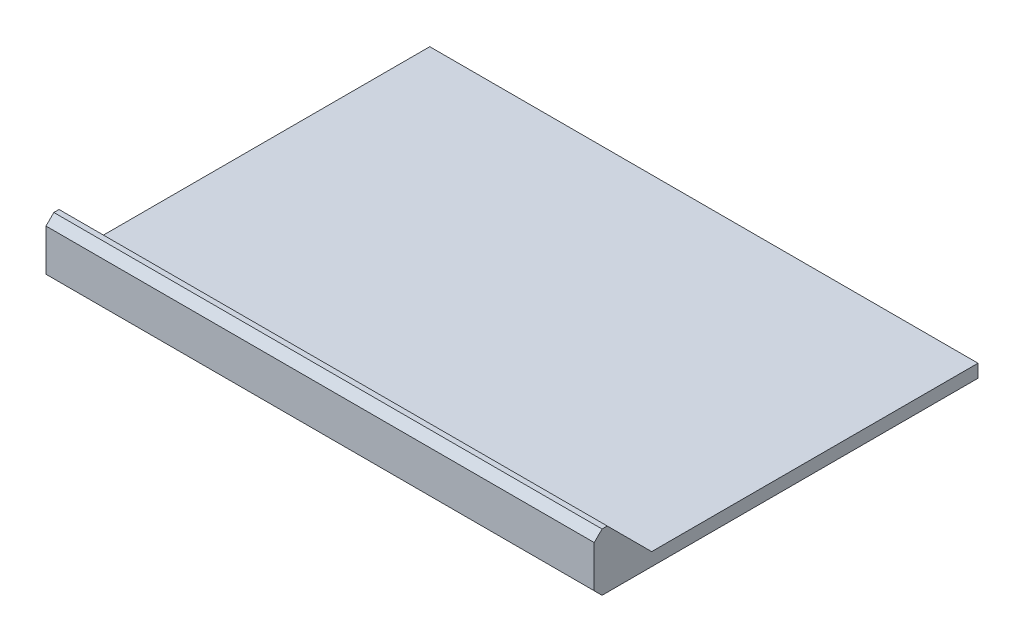
ISO-10303-21;
HEADER;
FILE_DESCRIPTION(('STEP AP214'),'2;1');
FILE_NAME('part.step','',(''),(''),'','','');
FILE_SCHEMA(('AUTOMOTIVE_DESIGN { 1 0 10303 214 1 1 1 1 }'));
ENDSEC;
DATA;
#1=APPLICATION_CONTEXT('core data for automotive mechanical design processes');
#2=APPLICATION_PROTOCOL_DEFINITION('international standard','automotive_design',2000,#1);
#3=PRODUCT_CONTEXT('',#1,'mechanical');
#4=PRODUCT('Part','Part','',(#3));
#5=PRODUCT_RELATED_PRODUCT_CATEGORY('part','',(#4));
#6=PRODUCT_DEFINITION_FORMATION('','',#4);
#7=PRODUCT_DEFINITION_CONTEXT('part definition',#1,'design');
#8=PRODUCT_DEFINITION('design','',#6,#7);
#9=PRODUCT_DEFINITION_SHAPE('','',#8);
#10=(LENGTH_UNIT() NAMED_UNIT(*) SI_UNIT(.MILLI.,.METRE.));
#11=(NAMED_UNIT(*) PLANE_ANGLE_UNIT() SI_UNIT($,.RADIAN.));
#12=(NAMED_UNIT(*) SI_UNIT($,.STERADIAN.) SOLID_ANGLE_UNIT());
#13=UNCERTAINTY_MEASURE_WITH_UNIT(LENGTH_MEASURE(1.E-05),#10,'distance_accuracy_value','');
#14=(GEOMETRIC_REPRESENTATION_CONTEXT(3) GLOBAL_UNCERTAINTY_ASSIGNED_CONTEXT((#13)) GLOBAL_UNIT_ASSIGNED_CONTEXT((#10,
#11,#12)) REPRESENTATION_CONTEXT('',''));
#15=CARTESIAN_POINT('',(0.,0.,0.));
#16=DIRECTION('',(0.,0.,1.));
#17=DIRECTION('',(1.,0.,0.));
#18=AXIS2_PLACEMENT_3D('',#15,#16,#17);
#19=CARTESIAN_POINT('',(0.,0.,0.));
#20=DIRECTION('',(0.,0.,-1.));
#21=DIRECTION('',(-1.,0.,0.));
#22=AXIS2_PLACEMENT_3D('',#19,#20,#21);
#23=PLANE('',#22);
#24=DIRECTION('',(1.,0.,0.));
#25=VECTOR('',#24,1.);
#26=CARTESIAN_POINT('',(0.,12.7,0.));
#27=LINE('',#26,#25);
#28=CARTESIAN_POINT('',(12.7,12.7,0.));
#29=VERTEX_POINT('',#28);
#30=CARTESIAN_POINT('',(520.7,12.7,-1.59747019993952E-13));
#31=VERTEX_POINT('',#30);
#32=EDGE_CURVE('E182',#29,#31,#27,.T.);
#33=ORIENTED_EDGE('',*,*,#32,.F.);
#34=DIRECTION('',(0.,-1.,0.));
#35=VECTOR('',#34,1.);
#36=CARTESIAN_POINT('',(12.7,55.88,0.));
#37=LINE('',#36,#35);
#38=CARTESIAN_POINT('',(12.7,55.88,0.));
#39=VERTEX_POINT('',#38);
#40=EDGE_CURVE('E128',#39,#29,#37,.T.);
#41=ORIENTED_EDGE('',*,*,#40,.F.);
#42=DIRECTION('',(-1.,0.,0.));
#43=VECTOR('',#42,1.);
#44=CARTESIAN_POINT('',(0.,55.88,0.));
#45=LINE('',#44,#43);
#46=CARTESIAN_POINT('',(520.7,55.88,0.));
#47=VERTEX_POINT('',#46);
#48=EDGE_CURVE('E157',#47,#39,#45,.T.);
#49=ORIENTED_EDGE('',*,*,#48,.F.);
#50=DIRECTION('',(0.,-1.,0.));
#51=VECTOR('',#50,1.);
#52=CARTESIAN_POINT('',(520.7,55.88,-1.59747019993952E-13));
#53=LINE('',#52,#51);
#54=EDGE_CURVE('E148',#47,#31,#53,.T.);
#55=ORIENTED_EDGE('',*,*,#54,.T.);
#56=EDGE_LOOP('',(#33,#41,#49,#55));
#57=FACE_BOUND('',#56,.T.);
#58=ADVANCED_FACE('F35',(#57),#23,.T.);
#59=CARTESIAN_POINT('',(0.,12.7,0.));
#60=DIRECTION('',(0.,-1.,0.));
#61=DIRECTION('',(0.,0.,-1.));
#62=AXIS2_PLACEMENT_3D('',#59,#60,#61);
#63=PLANE('',#62);
#64=DIRECTION('',(-1.,0.,0.));
#65=VECTOR('',#64,1.);
#66=CARTESIAN_POINT('',(12.7,12.7,-43.18));
#67=LINE('',#66,#65);
#68=CARTESIAN_POINT('',(12.7,12.7,-43.18));
#69=VERTEX_POINT('',#68);
#70=CARTESIAN_POINT('',(0.,12.7,-43.18));
#71=VERTEX_POINT('',#70);
#72=EDGE_CURVE('E122',#69,#71,#67,.T.);
#73=ORIENTED_EDGE('',*,*,#72,.F.);
#74=DIRECTION('',(0.,0.,-1.));
#75=VECTOR('',#74,1.);
#76=CARTESIAN_POINT('',(12.7,12.7,0.));
#77=LINE('',#76,#75);
#78=EDGE_CURVE('E129',#29,#69,#77,.T.);
#79=ORIENTED_EDGE('',*,*,#78,.F.);
#80=ORIENTED_EDGE('',*,*,#32,.T.);
#81=DIRECTION('',(0.,0.,-1.));
#82=VECTOR('',#81,1.);
#83=CARTESIAN_POINT('',(520.7,12.7,-1.59747019993952E-13));
#84=LINE('',#83,#82);
#85=CARTESIAN_POINT('',(520.7,12.7,-43.1800000000002));
#86=VERTEX_POINT('',#85);
#87=EDGE_CURVE('E151',#31,#86,#84,.T.);
#88=ORIENTED_EDGE('',*,*,#87,.T.);
#89=DIRECTION('',(1.,0.,0.));
#90=VECTOR('',#89,1.);
#91=CARTESIAN_POINT('',(520.7,12.7,-43.1800000000002));
#92=LINE('',#91,#90);
#93=CARTESIAN_POINT('',(533.4,12.7,-43.1800000000002));
#94=VERTEX_POINT('',#93);
#95=EDGE_CURVE('E153',#86,#94,#92,.T.);
#96=ORIENTED_EDGE('',*,*,#95,.T.);
#97=DIRECTION('',(0.,0.,1.));
#98=VECTOR('',#97,1.);
#99=CARTESIAN_POINT('',(533.4,12.7,-360.68));
#100=LINE('',#99,#98);
#101=CARTESIAN_POINT('',(533.4,12.7,-360.68));
#102=VERTEX_POINT('',#101);
#103=EDGE_CURVE('E179',#102,#94,#100,.T.);
#104=ORIENTED_EDGE('',*,*,#103,.F.);
#105=DIRECTION('',(1.,0.,0.));
#106=VECTOR('',#105,1.);
#107=CARTESIAN_POINT('',(0.,12.7,-360.68));
#108=LINE('',#107,#106);
#109=CARTESIAN_POINT('',(0.,12.7,-360.68));
#110=VERTEX_POINT('',#109);
#111=EDGE_CURVE('E175',#110,#102,#108,.T.);
#112=ORIENTED_EDGE('',*,*,#111,.F.);
#113=DIRECTION('',(0.,0.,-1.));
#114=VECTOR('',#113,1.);
#115=CARTESIAN_POINT('',(0.,12.7,0.));
#116=LINE('',#115,#114);
#117=EDGE_CURVE('E139',#71,#110,#116,.T.);
#118=ORIENTED_EDGE('',*,*,#117,.F.);
#119=EDGE_LOOP('',(#73,#79,#80,#88,#96,#104,#112,#118));
#120=FACE_BOUND('',#119,.T.);
#121=ADVANCED_FACE('F137',(#120),#63,.F.);
#122=CARTESIAN_POINT('',(0.,12.7,0.));
#123=DIRECTION('',(-1.,0.,0.));
#124=DIRECTION('',(0.,0.,1.));
#125=AXIS2_PLACEMENT_3D('',#122,#123,#124);
#126=PLANE('',#125);
#127=DIRECTION('',(0.,-1.,0.));
#128=VECTOR('',#127,1.);
#129=CARTESIAN_POINT('',(0.,0.,12.7));
#130=LINE('',#129,#128);
#131=CARTESIAN_POINT('',(0.,48.2599999999999,12.7));
#132=VERTEX_POINT('',#131);
#133=CARTESIAN_POINT('',(0.,7.61999999999996,12.7));
#134=VERTEX_POINT('',#133);
#135=EDGE_CURVE('E158',#132,#134,#130,.T.);
#136=ORIENTED_EDGE('',*,*,#135,.F.);
#137=DIRECTION('',(0.,-0.707106781186545,0.70710678118655));
#138=VECTOR('',#137,1.);
#139=CARTESIAN_POINT('',(0.,36.8300000000001,24.1299999999999));
#140=LINE('',#139,#138);
#141=CARTESIAN_POINT('',(0.,55.88,5.07999999999987));
#142=VERTEX_POINT('',#141);
#143=EDGE_CURVE('E202',#132,#142,#140,.F.);
#144=ORIENTED_EDGE('',*,*,#143,.T.);
#145=DIRECTION('',(0.,0.,-1.));
#146=VECTOR('',#145,1.);
#147=CARTESIAN_POINT('',(0.,55.88,12.7));
#148=LINE('',#147,#146);
#149=CARTESIAN_POINT('',(0.,55.88,0.));
#150=VERTEX_POINT('',#149);
#151=EDGE_CURVE('E165',#142,#150,#148,.T.);
#152=ORIENTED_EDGE('',*,*,#151,.T.);
#153=DIRECTION('',(0.,0.707106781186548,0.707106781186548));
#154=VECTOR('',#153,1.);
#155=CARTESIAN_POINT('',(0.,12.7,-43.18));
#156=LINE('',#155,#154);
#157=EDGE_CURVE('E135',#71,#150,#156,.T.);
#158=ORIENTED_EDGE('',*,*,#157,.F.);
#159=ORIENTED_EDGE('',*,*,#117,.T.);
#160=DIRECTION('',(0.,-1.,0.));
#161=VECTOR('',#160,1.);
#162=CARTESIAN_POINT('',(0.,12.7,-360.68));
#163=LINE('',#162,#161);
#164=CARTESIAN_POINT('',(0.,0.,-360.68));
#165=VERTEX_POINT('',#164);
#166=EDGE_CURVE('E184',#110,#165,#163,.T.);
#167=ORIENTED_EDGE('',*,*,#166,.T.);
#168=DIRECTION('',(0.,0.,-1.));
#169=VECTOR('',#168,1.);
#170=CARTESIAN_POINT('',(0.,0.,0.));
#171=LINE('',#170,#169);
#172=CARTESIAN_POINT('',(0.,0.,5.07999999999993));
#173=VERTEX_POINT('',#172);
#174=EDGE_CURVE('E173',#173,#165,#171,.T.);
#175=ORIENTED_EDGE('',*,*,#174,.F.);
#176=DIRECTION('',(0.,0.707106781186542,0.707106781186553));
#177=VECTOR('',#176,1.);
#178=CARTESIAN_POINT('',(0.,3.80999999999994,8.88999999999993));
#179=LINE('',#178,#177);
#180=EDGE_CURVE('E200',#173,#134,#179,.T.);
#181=ORIENTED_EDGE('',*,*,#180,.T.);
#182=EDGE_LOOP('',(#136,#144,#152,#158,#159,#167,#175,#181));
#183=FACE_BOUND('',#182,.T.);
#184=ADVANCED_FACE('F219',(#183),#126,.T.);
#185=CARTESIAN_POINT('',(533.4,12.7,-360.68));
#186=DIRECTION('',(1.,0.,0.));
#187=DIRECTION('',(0.,0.,-1.));
#188=AXIS2_PLACEMENT_3D('',#185,#186,#187);
#189=PLANE('',#188);
#190=ORIENTED_EDGE('',*,*,#103,.T.);
#191=DIRECTION('',(0.,0.707106781186548,0.707106781186548));
#192=VECTOR('',#191,1.);
#193=CARTESIAN_POINT('',(533.4,12.7,-43.1800000000002));
#194=LINE('',#193,#192);
#195=CARTESIAN_POINT('',(533.4,55.88,-1.64187912092453E-13));
#196=VERTEX_POINT('',#195);
#197=EDGE_CURVE('E140',#94,#196,#194,.T.);
#198=ORIENTED_EDGE('',*,*,#197,.T.);
#199=DIRECTION('',(0.,0.,-1.));
#200=VECTOR('',#199,1.);
#201=CARTESIAN_POINT('',(533.4,55.88,12.7));
#202=LINE('',#201,#200);
#203=CARTESIAN_POINT('',(533.4,55.88,5.07999999999987));
#204=VERTEX_POINT('',#203);
#205=EDGE_CURVE('E170',#204,#196,#202,.T.);
#206=ORIENTED_EDGE('',*,*,#205,.F.);
#207=DIRECTION('',(0.,0.707106781186545,-0.70710678118655));
#208=VECTOR('',#207,1.);
#209=CARTESIAN_POINT('',(533.4,217.17,-156.210000000001));
#210=LINE('',#209,#208);
#211=CARTESIAN_POINT('',(533.4,48.2599999999999,12.7));
#212=VERTEX_POINT('',#211);
#213=EDGE_CURVE('E43',#204,#212,#210,.F.);
#214=ORIENTED_EDGE('',*,*,#213,.T.);
#215=DIRECTION('',(0.,1.,0.));
#216=VECTOR('',#215,1.);
#217=CARTESIAN_POINT('',(533.4,0.,12.7));
#218=LINE('',#217,#216);
#219=CARTESIAN_POINT('',(533.4,7.61999999999996,12.7));
#220=VERTEX_POINT('',#219);
#221=EDGE_CURVE('E161',#220,#212,#218,.T.);
#222=ORIENTED_EDGE('',*,*,#221,.F.);
#223=DIRECTION('',(0.,-0.707106781186542,-0.707106781186553));
#224=VECTOR('',#223,1.);
#225=CARTESIAN_POINT('',(533.4,-176.53,-171.450000000003));
#226=LINE('',#225,#224);
#227=CARTESIAN_POINT('',(533.4,0.,5.07999999999992));
#228=VERTEX_POINT('',#227);
#229=EDGE_CURVE('E58',#220,#228,#226,.T.);
#230=ORIENTED_EDGE('',*,*,#229,.T.);
#231=DIRECTION('',(0.,0.,1.));
#232=VECTOR('',#231,1.);
#233=CARTESIAN_POINT('',(533.4,0.,-360.68));
#234=LINE('',#233,#232);
#235=CARTESIAN_POINT('',(533.4,0.,-360.68));
#236=VERTEX_POINT('',#235);
#237=EDGE_CURVE('E176',#236,#228,#234,.T.);
#238=ORIENTED_EDGE('',*,*,#237,.F.);
#239=DIRECTION('',(0.,-1.,0.));
#240=VECTOR('',#239,1.);
#241=CARTESIAN_POINT('',(533.4,12.7,-360.68));
#242=LINE('',#241,#240);
#243=EDGE_CURVE('E190',#102,#236,#242,.T.);
#244=ORIENTED_EDGE('',*,*,#243,.F.);
#245=EDGE_LOOP('',(#190,#198,#206,#214,#222,#230,#238,#244));
#246=FACE_BOUND('',#245,.T.);
#247=ADVANCED_FACE('F208',(#246),#189,.T.);
#248=CARTESIAN_POINT('',(0.,12.7,-360.68));
#249=DIRECTION('',(0.,0.,-1.));
#250=DIRECTION('',(-1.,0.,0.));
#251=AXIS2_PLACEMENT_3D('',#248,#249,#250);
#252=PLANE('',#251);
#253=DIRECTION('',(1.,0.,0.));
#254=VECTOR('',#253,1.);
#255=CARTESIAN_POINT('',(0.,0.,-360.68));
#256=LINE('',#255,#254);
#257=EDGE_CURVE('E186',#165,#236,#256,.T.);
#258=ORIENTED_EDGE('',*,*,#257,.F.);
#259=ORIENTED_EDGE('',*,*,#166,.F.);
#260=ORIENTED_EDGE('',*,*,#111,.T.);
#261=ORIENTED_EDGE('',*,*,#243,.T.);
#262=EDGE_LOOP('',(#258,#259,#260,#261));
#263=FACE_BOUND('',#262,.T.);
#264=ADVANCED_FACE('F230',(#263),#252,.T.);
#265=CARTESIAN_POINT('',(0.,0.,0.));
#266=DIRECTION('',(0.,-1.,0.));
#267=DIRECTION('',(0.,0.,-1.));
#268=AXIS2_PLACEMENT_3D('',#265,#266,#267);
#269=PLANE('',#268);
#270=ORIENTED_EDGE('',*,*,#237,.T.);
#271=DIRECTION('',(-1.,0.,0.));
#272=VECTOR('',#271,1.);
#273=CARTESIAN_POINT('',(0.,0.,5.07999999999993));
#274=LINE('',#273,#272);
#275=EDGE_CURVE('E11',#228,#173,#274,.T.);
#276=ORIENTED_EDGE('',*,*,#275,.T.);
#277=ORIENTED_EDGE('',*,*,#174,.T.);
#278=ORIENTED_EDGE('',*,*,#257,.T.);
#279=EDGE_LOOP('',(#270,#276,#277,#278));
#280=FACE_BOUND('',#279,.T.);
#281=ADVANCED_FACE('F234',(#280),#269,.T.);
#282=CARTESIAN_POINT('',(0.,55.88,12.7));
#283=DIRECTION('',(0.,-1.,0.));
#284=DIRECTION('',(0.,0.,-1.));
#285=AXIS2_PLACEMENT_3D('',#282,#283,#284);
#286=PLANE('',#285);
#287=ORIENTED_EDGE('',*,*,#151,.F.);
#288=DIRECTION('',(1.,0.,0.));
#289=VECTOR('',#288,1.);
#290=CARTESIAN_POINT('',(0.,55.88,5.07999999999987));
#291=LINE('',#290,#289);
#292=EDGE_CURVE('E204',#142,#204,#291,.T.);
#293=ORIENTED_EDGE('',*,*,#292,.T.);
#294=ORIENTED_EDGE('',*,*,#205,.T.);
#295=EDGE_CURVE('E162',#196,#47,#45,.T.);
#296=ORIENTED_EDGE('',*,*,#295,.T.);
#297=ORIENTED_EDGE('',*,*,#48,.T.);
#298=DIRECTION('',(-1.,0.,0.));
#299=VECTOR('',#298,1.);
#300=CARTESIAN_POINT('',(12.7,55.88,0.));
#301=LINE('',#300,#299);
#302=EDGE_CURVE('E125',#39,#150,#301,.T.);
#303=ORIENTED_EDGE('',*,*,#302,.T.);
#304=EDGE_LOOP('',(#287,#293,#294,#296,#297,#303));
#305=FACE_BOUND('',#304,.T.);
#306=ADVANCED_FACE('F221',(#305),#286,.F.);
#307=CARTESIAN_POINT('',(0.,0.,12.7));
#308=DIRECTION('',(0.,0.,-1.));
#309=DIRECTION('',(-1.,0.,0.));
#310=AXIS2_PLACEMENT_3D('',#307,#308,#309);
#311=PLANE('',#310);
#312=ORIENTED_EDGE('',*,*,#221,.T.);
#313=DIRECTION('',(-1.,0.,0.));
#314=VECTOR('',#313,1.);
#315=CARTESIAN_POINT('',(0.,48.2599999999999,12.7));
#316=LINE('',#315,#314);
#317=EDGE_CURVE('E197',#212,#132,#316,.T.);
#318=ORIENTED_EDGE('',*,*,#317,.T.);
#319=ORIENTED_EDGE('',*,*,#135,.T.);
#320=DIRECTION('',(1.,0.,0.));
#321=VECTOR('',#320,1.);
#322=CARTESIAN_POINT('',(533.4,7.61999999999996,12.7));
#323=LINE('',#322,#321);
#324=EDGE_CURVE('E192',#134,#220,#323,.T.);
#325=ORIENTED_EDGE('',*,*,#324,.T.);
#326=EDGE_LOOP('',(#312,#318,#319,#325));
#327=FACE_BOUND('',#326,.T.);
#328=ADVANCED_FACE('F213',(#327),#311,.F.);
#329=CARTESIAN_POINT('',(0.,48.2599999999999,12.7));
#330=DIRECTION('',(0.,-0.70710678118655,-0.707106781186545));
#331=DIRECTION('',(-1.,0.,0.));
#332=AXIS2_PLACEMENT_3D('',#329,#330,#331);
#333=PLANE('',#332);
#334=ORIENTED_EDGE('',*,*,#213,.F.);
#335=ORIENTED_EDGE('',*,*,#292,.F.);
#336=ORIENTED_EDGE('',*,*,#143,.F.);
#337=ORIENTED_EDGE('',*,*,#317,.F.);
#338=EDGE_LOOP('',(#334,#335,#336,#337));
#339=FACE_BOUND('',#338,.T.);
#340=ADVANCED_FACE('F216',(#339),#333,.F.);
#341=CARTESIAN_POINT('',(0.,7.61999999999996,12.7));
#342=DIRECTION('',(0.,-0.707106781186553,0.707106781186542));
#343=DIRECTION('',(-1.,0.,0.));
#344=AXIS2_PLACEMENT_3D('',#341,#342,#343);
#345=PLANE('',#344);
#346=ORIENTED_EDGE('',*,*,#180,.F.);
#347=ORIENTED_EDGE('',*,*,#275,.F.);
#348=ORIENTED_EDGE('',*,*,#229,.F.);
#349=ORIENTED_EDGE('',*,*,#324,.F.);
#350=EDGE_LOOP('',(#346,#347,#348,#349));
#351=FACE_BOUND('',#350,.T.);
#352=ADVANCED_FACE('F37',(#351),#345,.T.);
#353=CARTESIAN_POINT('',(520.7,12.7,-43.1800000000002));
#354=DIRECTION('',(0.,0.707106781186548,-0.707106781186548));
#355=DIRECTION('',(0.,0.707106781186548,0.707106781186548));
#356=AXIS2_PLACEMENT_3D('',#353,#354,#355);
#357=PLANE('',#356);
#358=ORIENTED_EDGE('',*,*,#197,.F.);
#359=ORIENTED_EDGE('',*,*,#95,.F.);
#360=DIRECTION('',(0.,0.707106781186548,0.707106781186548));
#361=VECTOR('',#360,1.);
#362=CARTESIAN_POINT('',(520.7,12.7,-43.1800000000002));
#363=LINE('',#362,#361);
#364=EDGE_CURVE('E50',#86,#47,#363,.T.);
#365=ORIENTED_EDGE('',*,*,#364,.T.);
#366=ORIENTED_EDGE('',*,*,#295,.F.);
#367=EDGE_LOOP('',(#358,#359,#365,#366));
#368=FACE_BOUND('',#367,.T.);
#369=ADVANCED_FACE('F238',(#368),#357,.T.);
#370=CARTESIAN_POINT('',(520.7,0.,0.));
#371=DIRECTION('',(1.,0.,0.));
#372=DIRECTION('',(0.,0.,-1.));
#373=AXIS2_PLACEMENT_3D('',#370,#371,#372);
#374=PLANE('',#373);
#375=ORIENTED_EDGE('',*,*,#364,.F.);
#376=ORIENTED_EDGE('',*,*,#87,.F.);
#377=ORIENTED_EDGE('',*,*,#54,.F.);
#378=EDGE_LOOP('',(#375,#376,#377));
#379=FACE_BOUND('',#378,.T.);
#380=ADVANCED_FACE('F243',(#379),#374,.F.);
#381=CARTESIAN_POINT('',(12.7,12.7,-43.18));
#382=DIRECTION('',(0.,-0.707106781186548,0.707106781186548));
#383=DIRECTION('',(0.,-0.707106781186548,-0.707106781186548));
#384=AXIS2_PLACEMENT_3D('',#381,#382,#383);
#385=PLANE('',#384);
#386=ORIENTED_EDGE('',*,*,#157,.T.);
#387=ORIENTED_EDGE('',*,*,#302,.F.);
#388=DIRECTION('',(0.,0.707106781186548,0.707106781186548));
#389=VECTOR('',#388,1.);
#390=CARTESIAN_POINT('',(12.7,12.7,-43.18));
#391=LINE('',#390,#389);
#392=EDGE_CURVE('E118',#69,#39,#391,.T.);
#393=ORIENTED_EDGE('',*,*,#392,.F.);
#394=ORIENTED_EDGE('',*,*,#72,.T.);
#395=EDGE_LOOP('',(#386,#387,#393,#394));
#396=FACE_BOUND('',#395,.T.);
#397=ADVANCED_FACE('F120',(#396),#385,.F.);
#398=CARTESIAN_POINT('',(12.7,0.,0.));
#399=DIRECTION('',(-1.,0.,0.));
#400=DIRECTION('',(0.,0.,1.));
#401=AXIS2_PLACEMENT_3D('',#398,#399,#400);
#402=PLANE('',#401);
#403=ORIENTED_EDGE('',*,*,#78,.T.);
#404=ORIENTED_EDGE('',*,*,#392,.T.);
#405=ORIENTED_EDGE('',*,*,#40,.T.);
#406=EDGE_LOOP('',(#403,#404,#405));
#407=FACE_BOUND('',#406,.T.);
#408=ADVANCED_FACE('F132',(#407),#402,.F.);
#409=CLOSED_SHELL('',(#58,#121,#184,#247,#264,#281,#306,#328,#340,#352,#369,#380,#397,#408));
#410=MANIFOLD_SOLID_BREP('B2',#409);
#411=ADVANCED_BREP_SHAPE_REPRESENTATION('',(#18,#410),#14);
#412=SHAPE_DEFINITION_REPRESENTATION(#9,#411);
ENDSEC;
END-ISO-10303-21;
